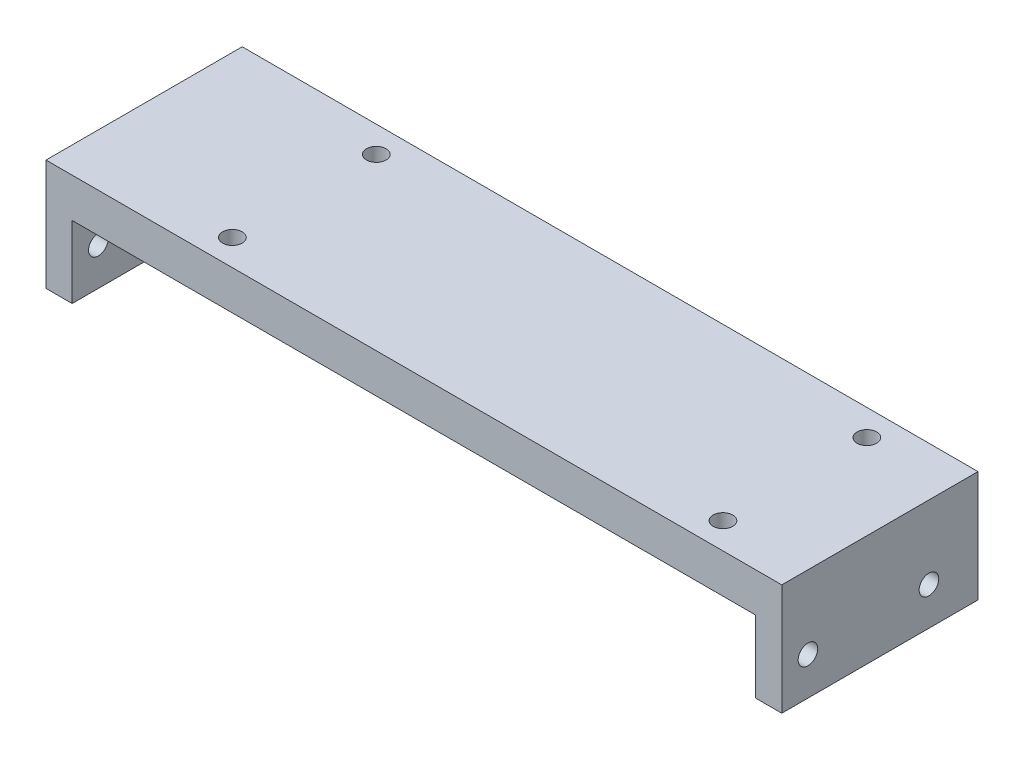
ISO-10303-21;
HEADER;
FILE_DESCRIPTION(('STEP AP214'),'2;1');
FILE_NAME('part.step','',(''),(''),'','','');
FILE_SCHEMA(('AUTOMOTIVE_DESIGN { 1 0 10303 214 1 1 1 1 }'));
ENDSEC;
DATA;
#1=APPLICATION_CONTEXT('core data for automotive mechanical design processes');
#2=APPLICATION_PROTOCOL_DEFINITION('international standard','automotive_design',2000,#1);
#3=PRODUCT_CONTEXT('',#1,'mechanical');
#4=PRODUCT('Part','Part','',(#3));
#5=PRODUCT_RELATED_PRODUCT_CATEGORY('part','',(#4));
#6=PRODUCT_DEFINITION_FORMATION('','',#4);
#7=PRODUCT_DEFINITION_CONTEXT('part definition',#1,'design');
#8=PRODUCT_DEFINITION('design','',#6,#7);
#9=PRODUCT_DEFINITION_SHAPE('','',#8);
#10=(LENGTH_UNIT() NAMED_UNIT(*) SI_UNIT(.MILLI.,.METRE.));
#11=(NAMED_UNIT(*) PLANE_ANGLE_UNIT() SI_UNIT($,.RADIAN.));
#12=(NAMED_UNIT(*) SI_UNIT($,.STERADIAN.) SOLID_ANGLE_UNIT());
#13=UNCERTAINTY_MEASURE_WITH_UNIT(LENGTH_MEASURE(1.E-05),#10,'distance_accuracy_value','');
#14=(GEOMETRIC_REPRESENTATION_CONTEXT(3) GLOBAL_UNCERTAINTY_ASSIGNED_CONTEXT((#13)) GLOBAL_UNIT_ASSIGNED_CONTEXT((#10,
#11,#12)) REPRESENTATION_CONTEXT('',''));
#15=CARTESIAN_POINT('',(0.,0.,0.));
#16=DIRECTION('',(0.,0.,1.));
#17=DIRECTION('',(1.,0.,0.));
#18=AXIS2_PLACEMENT_3D('',#15,#16,#17);
#19=CARTESIAN_POINT('',(0.,6.,0.));
#20=DIRECTION('',(0.,-1.,0.));
#21=DIRECTION('',(0.,0.,-1.));
#22=AXIS2_PLACEMENT_3D('',#19,#20,#21);
#23=PLANE('',#22);
#24=DIRECTION('',(-1.,0.,0.));
#25=VECTOR('',#24,1.);
#26=CARTESIAN_POINT('',(-52.25,6.,-15.));
#27=LINE('',#26,#25);
#28=CARTESIAN_POINT('',(56.25,6.,-15.));
#29=VERTEX_POINT('',#28);
#30=CARTESIAN_POINT('',(-56.25,6.,-15.));
#31=VERTEX_POINT('',#30);
#32=EDGE_CURVE('E45',#29,#31,#27,.T.);
#33=ORIENTED_EDGE('',*,*,#32,.T.);
#34=DIRECTION('',(0.,0.,-1.));
#35=VECTOR('',#34,1.);
#36=CARTESIAN_POINT('',(-56.25,6.,15.));
#37=LINE('',#36,#35);
#38=CARTESIAN_POINT('',(-56.25,6.,15.));
#39=VERTEX_POINT('',#38);
#40=EDGE_CURVE('E160',#39,#31,#37,.T.);
#41=ORIENTED_EDGE('',*,*,#40,.F.);
#42=DIRECTION('',(1.,0.,0.));
#43=VECTOR('',#42,1.);
#44=CARTESIAN_POINT('',(-52.25,6.,15.));
#45=LINE('',#44,#43);
#46=CARTESIAN_POINT('',(56.25,6.,15.));
#47=VERTEX_POINT('',#46);
#48=EDGE_CURVE('E11',#39,#47,#45,.T.);
#49=ORIENTED_EDGE('',*,*,#48,.T.);
#50=DIRECTION('',(0.,0.,1.));
#51=VECTOR('',#50,1.);
#52=CARTESIAN_POINT('',(56.25,6.,-15.));
#53=LINE('',#52,#51);
#54=EDGE_CURVE('E113',#29,#47,#53,.T.);
#55=ORIENTED_EDGE('',*,*,#54,.F.);
#56=EDGE_LOOP('',(#33,#41,#49,#55));
#57=FACE_BOUND('',#56,.T.);
#58=CARTESIAN_POINT('',(-31.75,6.,-11.));
#59=DIRECTION('',(0.,1.,0.));
#60=DIRECTION('',(0.,0.,1.));
#61=AXIS2_PLACEMENT_3D('',#58,#59,#60);
#62=CIRCLE('',#61,1.5);
#63=CARTESIAN_POINT('',(-31.75,6.,-9.5));
#64=VERTEX_POINT('',#63);
#65=EDGE_CURVE('E195',#64,#64,#62,.T.);
#66=ORIENTED_EDGE('',*,*,#65,.F.);
#67=EDGE_LOOP('',(#66));
#68=FACE_BOUND('',#67,.T.);
#69=CARTESIAN_POINT('',(43.25,6.,-11.));
#70=DIRECTION('',(0.,1.,0.));
#71=DIRECTION('',(0.,0.,1.));
#72=AXIS2_PLACEMENT_3D('',#69,#70,#71);
#73=CIRCLE('',#72,1.5);
#74=CARTESIAN_POINT('',(43.25,6.,-9.49999999999999));
#75=VERTEX_POINT('',#74);
#76=EDGE_CURVE('E189',#75,#75,#73,.T.);
#77=ORIENTED_EDGE('',*,*,#76,.F.);
#78=EDGE_LOOP('',(#77));
#79=FACE_BOUND('',#78,.T.);
#80=CARTESIAN_POINT('',(43.25,6.,11.));
#81=DIRECTION('',(0.,1.,0.));
#82=DIRECTION('',(0.,0.,-1.));
#83=AXIS2_PLACEMENT_3D('',#80,#81,#82);
#84=CIRCLE('',#83,1.5);
#85=CARTESIAN_POINT('',(43.25,6.,9.49999999999999));
#86=VERTEX_POINT('',#85);
#87=EDGE_CURVE('E183',#86,#86,#84,.T.);
#88=ORIENTED_EDGE('',*,*,#87,.F.);
#89=EDGE_LOOP('',(#88));
#90=FACE_BOUND('',#89,.T.);
#91=CARTESIAN_POINT('',(-31.75,6.,11.));
#92=DIRECTION('',(0.,1.,0.));
#93=DIRECTION('',(0.,0.,-1.));
#94=AXIS2_PLACEMENT_3D('',#91,#92,#93);
#95=CIRCLE('',#94,1.5);
#96=CARTESIAN_POINT('',(-31.75,6.,9.5));
#97=VERTEX_POINT('',#96);
#98=EDGE_CURVE('E177',#97,#97,#95,.T.);
#99=ORIENTED_EDGE('',*,*,#98,.F.);
#100=EDGE_LOOP('',(#99));
#101=FACE_BOUND('',#100,.T.);
#102=ADVANCED_FACE('F36',(#57,#68,#79,#90,#101),#23,.F.);
#103=CARTESIAN_POINT('',(0.,0.,0.));
#104=DIRECTION('',(0.,-1.,0.));
#105=DIRECTION('',(0.,0.,-1.));
#106=AXIS2_PLACEMENT_3D('',#103,#104,#105);
#107=PLANE('',#106);
#108=CARTESIAN_POINT('',(43.25,0.,11.));
#109=DIRECTION('',(0.,1.,0.));
#110=DIRECTION('',(0.,0.,-1.));
#111=AXIS2_PLACEMENT_3D('',#108,#109,#110);
#112=CIRCLE('',#111,1.5);
#113=CARTESIAN_POINT('',(43.25,0.,9.49999999999999));
#114=VERTEX_POINT('',#113);
#115=EDGE_CURVE('E180',#114,#114,#112,.T.);
#116=ORIENTED_EDGE('',*,*,#115,.T.);
#117=EDGE_LOOP('',(#116));
#118=FACE_BOUND('',#117,.T.);
#119=CARTESIAN_POINT('',(-31.75,0.,-11.));
#120=DIRECTION('',(0.,1.,0.));
#121=DIRECTION('',(0.,0.,1.));
#122=AXIS2_PLACEMENT_3D('',#119,#120,#121);
#123=CIRCLE('',#122,1.5);
#124=CARTESIAN_POINT('',(-31.75,0.,-9.5));
#125=VERTEX_POINT('',#124);
#126=EDGE_CURVE('E192',#125,#125,#123,.T.);
#127=ORIENTED_EDGE('',*,*,#126,.T.);
#128=EDGE_LOOP('',(#127));
#129=FACE_BOUND('',#128,.T.);
#130=DIRECTION('',(-1.,0.,0.));
#131=VECTOR('',#130,1.);
#132=CARTESIAN_POINT('',(-52.25,0.,-15.));
#133=LINE('',#132,#131);
#134=CARTESIAN_POINT('',(52.25,0.,-15.));
#135=VERTEX_POINT('',#134);
#136=CARTESIAN_POINT('',(-52.25,0.,-15.));
#137=VERTEX_POINT('',#136);
#138=EDGE_CURVE('E198',#135,#137,#133,.T.);
#139=ORIENTED_EDGE('',*,*,#138,.F.);
#140=DIRECTION('',(0.,0.,-1.));
#141=VECTOR('',#140,1.);
#142=CARTESIAN_POINT('',(52.25,0.,-15.));
#143=LINE('',#142,#141);
#144=CARTESIAN_POINT('',(52.25,0.,15.));
#145=VERTEX_POINT('',#144);
#146=EDGE_CURVE('E40',#145,#135,#143,.T.);
#147=ORIENTED_EDGE('',*,*,#146,.F.);
#148=DIRECTION('',(1.,0.,0.));
#149=VECTOR('',#148,1.);
#150=CARTESIAN_POINT('',(-52.25,0.,15.));
#151=LINE('',#150,#149);
#152=CARTESIAN_POINT('',(-52.25,0.,15.));
#153=VERTEX_POINT('',#152);
#154=EDGE_CURVE('E53',#153,#145,#151,.T.);
#155=ORIENTED_EDGE('',*,*,#154,.F.);
#156=DIRECTION('',(0.,0.,1.));
#157=VECTOR('',#156,1.);
#158=CARTESIAN_POINT('',(-52.25,0.,-15.));
#159=LINE('',#158,#157);
#160=EDGE_CURVE('E60',#137,#153,#159,.T.);
#161=ORIENTED_EDGE('',*,*,#160,.F.);
#162=EDGE_LOOP('',(#139,#147,#155,#161));
#163=FACE_BOUND('',#162,.T.);
#164=CARTESIAN_POINT('',(43.25,0.,-11.));
#165=DIRECTION('',(0.,1.,0.));
#166=DIRECTION('',(0.,0.,1.));
#167=AXIS2_PLACEMENT_3D('',#164,#165,#166);
#168=CIRCLE('',#167,1.5);
#169=CARTESIAN_POINT('',(43.25,0.,-9.49999999999999));
#170=VERTEX_POINT('',#169);
#171=EDGE_CURVE('E186',#170,#170,#168,.T.);
#172=ORIENTED_EDGE('',*,*,#171,.T.);
#173=EDGE_LOOP('',(#172));
#174=FACE_BOUND('',#173,.T.);
#175=CARTESIAN_POINT('',(-31.75,0.,11.));
#176=DIRECTION('',(0.,1.,0.));
#177=DIRECTION('',(0.,0.,-1.));
#178=AXIS2_PLACEMENT_3D('',#175,#176,#177);
#179=CIRCLE('',#178,1.5);
#180=CARTESIAN_POINT('',(-31.75,0.,9.5));
#181=VERTEX_POINT('',#180);
#182=EDGE_CURVE('E176',#181,#181,#179,.T.);
#183=ORIENTED_EDGE('',*,*,#182,.T.);
#184=EDGE_LOOP('',(#183));
#185=FACE_BOUND('',#184,.T.);
#186=ADVANCED_FACE('F246',(#118,#129,#163,#174,#185),#107,.T.);
#187=CARTESIAN_POINT('',(-52.25,6.,-15.));
#188=DIRECTION('',(0.,0.,1.));
#189=DIRECTION('',(1.,0.,0.));
#190=AXIS2_PLACEMENT_3D('',#187,#188,#189);
#191=PLANE('',#190);
#192=ORIENTED_EDGE('',*,*,#138,.T.);
#193=DIRECTION('',(0.,-1.,0.));
#194=VECTOR('',#193,1.);
#195=CARTESIAN_POINT('',(-52.25,6.,-15.));
#196=LINE('',#195,#194);
#197=CARTESIAN_POINT('',(-52.25,-11.,-15.));
#198=VERTEX_POINT('',#197);
#199=EDGE_CURVE('E168',#137,#198,#196,.T.);
#200=ORIENTED_EDGE('',*,*,#199,.T.);
#201=DIRECTION('',(1.,0.,0.));
#202=VECTOR('',#201,1.);
#203=CARTESIAN_POINT('',(-56.25,-11.,-15.));
#204=LINE('',#203,#202);
#205=CARTESIAN_POINT('',(-56.25,-11.,-15.));
#206=VERTEX_POINT('',#205);
#207=EDGE_CURVE('E173',#206,#198,#204,.T.);
#208=ORIENTED_EDGE('',*,*,#207,.F.);
#209=DIRECTION('',(0.,-1.,0.));
#210=VECTOR('',#209,1.);
#211=CARTESIAN_POINT('',(-56.25,6.,-15.));
#212=LINE('',#211,#210);
#213=EDGE_CURVE('E107',#31,#206,#212,.T.);
#214=ORIENTED_EDGE('',*,*,#213,.F.);
#215=ORIENTED_EDGE('',*,*,#32,.F.);
#216=DIRECTION('',(0.,1.,0.));
#217=VECTOR('',#216,1.);
#218=CARTESIAN_POINT('',(56.25,6.,-15.));
#219=LINE('',#218,#217);
#220=CARTESIAN_POINT('',(56.25,-11.,-15.));
#221=VERTEX_POINT('',#220);
#222=EDGE_CURVE('E105',#221,#29,#219,.T.);
#223=ORIENTED_EDGE('',*,*,#222,.F.);
#224=DIRECTION('',(-1.,0.,0.));
#225=VECTOR('',#224,1.);
#226=CARTESIAN_POINT('',(56.25,-11.,-15.));
#227=LINE('',#226,#225);
#228=CARTESIAN_POINT('',(52.25,-11.,-15.));
#229=VERTEX_POINT('',#228);
#230=EDGE_CURVE('E134',#221,#229,#227,.T.);
#231=ORIENTED_EDGE('',*,*,#230,.T.);
#232=DIRECTION('',(0.,1.,0.));
#233=VECTOR('',#232,1.);
#234=CARTESIAN_POINT('',(52.25,6.,-15.));
#235=LINE('',#234,#233);
#236=EDGE_CURVE('E135',#229,#135,#235,.T.);
#237=ORIENTED_EDGE('',*,*,#236,.T.);
#238=EDGE_LOOP('',(#192,#200,#208,#214,#215,#223,#231,#237));
#239=FACE_BOUND('',#238,.T.);
#240=ADVANCED_FACE('F38',(#239),#191,.F.);
#241=CARTESIAN_POINT('',(-52.25,6.,15.));
#242=DIRECTION('',(0.,0.,-1.));
#243=DIRECTION('',(-1.,0.,0.));
#244=AXIS2_PLACEMENT_3D('',#241,#242,#243);
#245=PLANE('',#244);
#246=ORIENTED_EDGE('',*,*,#154,.T.);
#247=DIRECTION('',(0.,-1.,0.));
#248=VECTOR('',#247,1.);
#249=CARTESIAN_POINT('',(52.25,6.,15.));
#250=LINE('',#249,#248);
#251=CARTESIAN_POINT('',(52.25,-11.,15.));
#252=VERTEX_POINT('',#251);
#253=EDGE_CURVE('E126',#145,#252,#250,.T.);
#254=ORIENTED_EDGE('',*,*,#253,.T.);
#255=DIRECTION('',(-1.,0.,0.));
#256=VECTOR('',#255,1.);
#257=CARTESIAN_POINT('',(56.25,-11.,15.));
#258=LINE('',#257,#256);
#259=CARTESIAN_POINT('',(56.25,-11.,15.));
#260=VERTEX_POINT('',#259);
#261=EDGE_CURVE('E141',#260,#252,#258,.T.);
#262=ORIENTED_EDGE('',*,*,#261,.F.);
#263=DIRECTION('',(0.,-1.,0.));
#264=VECTOR('',#263,1.);
#265=CARTESIAN_POINT('',(56.25,6.,15.));
#266=LINE('',#265,#264);
#267=EDGE_CURVE('E117',#47,#260,#266,.T.);
#268=ORIENTED_EDGE('',*,*,#267,.F.);
#269=ORIENTED_EDGE('',*,*,#48,.F.);
#270=DIRECTION('',(0.,1.,0.));
#271=VECTOR('',#270,1.);
#272=CARTESIAN_POINT('',(-56.25,6.,15.));
#273=LINE('',#272,#271);
#274=CARTESIAN_POINT('',(-56.25,-11.,15.));
#275=VERTEX_POINT('',#274);
#276=EDGE_CURVE('E157',#275,#39,#273,.T.);
#277=ORIENTED_EDGE('',*,*,#276,.F.);
#278=DIRECTION('',(1.,0.,0.));
#279=VECTOR('',#278,1.);
#280=CARTESIAN_POINT('',(-56.25,-11.,15.));
#281=LINE('',#280,#279);
#282=CARTESIAN_POINT('',(-52.25,-11.,15.));
#283=VERTEX_POINT('',#282);
#284=EDGE_CURVE('E166',#275,#283,#281,.T.);
#285=ORIENTED_EDGE('',*,*,#284,.T.);
#286=DIRECTION('',(0.,1.,0.));
#287=VECTOR('',#286,1.);
#288=CARTESIAN_POINT('',(-52.25,6.,15.));
#289=LINE('',#288,#287);
#290=EDGE_CURVE('E154',#283,#153,#289,.T.);
#291=ORIENTED_EDGE('',*,*,#290,.T.);
#292=EDGE_LOOP('',(#246,#254,#262,#268,#269,#277,#285,#291));
#293=FACE_BOUND('',#292,.T.);
#294=ADVANCED_FACE('F213',(#293),#245,.F.);
#295=CARTESIAN_POINT('',(-31.75,6.,-11.));
#296=DIRECTION('',(0.,-1.,0.));
#297=DIRECTION('',(0.,0.,-1.));
#298=AXIS2_PLACEMENT_3D('',#295,#296,#297);
#299=CYLINDRICAL_SURFACE('',#298,1.5);
#300=ORIENTED_EDGE('',*,*,#65,.T.);
#301=EDGE_LOOP('',(#300));
#302=FACE_BOUND('',#301,.T.);
#303=ORIENTED_EDGE('',*,*,#126,.F.);
#304=EDGE_LOOP('',(#303));
#305=FACE_BOUND('',#304,.T.);
#306=ADVANCED_FACE('F254',(#302,#305),#299,.F.);
#307=CARTESIAN_POINT('',(43.25,6.,-11.));
#308=DIRECTION('',(0.,-1.,0.));
#309=DIRECTION('',(0.,0.,-1.));
#310=AXIS2_PLACEMENT_3D('',#307,#308,#309);
#311=CYLINDRICAL_SURFACE('',#310,1.5);
#312=ORIENTED_EDGE('',*,*,#76,.T.);
#313=EDGE_LOOP('',(#312));
#314=FACE_BOUND('',#313,.T.);
#315=ORIENTED_EDGE('',*,*,#171,.F.);
#316=EDGE_LOOP('',(#315));
#317=FACE_BOUND('',#316,.T.);
#318=ADVANCED_FACE('F261',(#314,#317),#311,.F.);
#319=CARTESIAN_POINT('',(43.25,6.,11.));
#320=DIRECTION('',(0.,-1.,0.));
#321=DIRECTION('',(0.,0.,-1.));
#322=AXIS2_PLACEMENT_3D('',#319,#320,#321);
#323=CYLINDRICAL_SURFACE('',#322,1.5);
#324=ORIENTED_EDGE('',*,*,#87,.T.);
#325=EDGE_LOOP('',(#324));
#326=FACE_BOUND('',#325,.T.);
#327=ORIENTED_EDGE('',*,*,#115,.F.);
#328=EDGE_LOOP('',(#327));
#329=FACE_BOUND('',#328,.T.);
#330=ADVANCED_FACE('F319',(#326,#329),#323,.F.);
#331=CARTESIAN_POINT('',(-31.75,6.,11.));
#332=DIRECTION('',(0.,-1.,0.));
#333=DIRECTION('',(0.,0.,-1.));
#334=AXIS2_PLACEMENT_3D('',#331,#332,#333);
#335=CYLINDRICAL_SURFACE('',#334,1.5);
#336=ORIENTED_EDGE('',*,*,#98,.T.);
#337=EDGE_LOOP('',(#336));
#338=FACE_BOUND('',#337,.T.);
#339=ORIENTED_EDGE('',*,*,#182,.F.);
#340=EDGE_LOOP('',(#339));
#341=FACE_BOUND('',#340,.T.);
#342=ADVANCED_FACE('F309',(#338,#341),#335,.F.);
#343=CARTESIAN_POINT('',(-56.25,0.,0.));
#344=DIRECTION('',(1.,0.,0.));
#345=DIRECTION('',(0.,0.,-1.));
#346=AXIS2_PLACEMENT_3D('',#343,#344,#345);
#347=PLANE('',#346);
#348=ORIENTED_EDGE('',*,*,#276,.T.);
#349=ORIENTED_EDGE('',*,*,#40,.T.);
#350=ORIENTED_EDGE('',*,*,#213,.T.);
#351=DIRECTION('',(0.,0.,1.));
#352=VECTOR('',#351,1.);
#353=CARTESIAN_POINT('',(-56.25,-11.,15.));
#354=LINE('',#353,#352);
#355=EDGE_CURVE('E164',#206,#275,#354,.T.);
#356=ORIENTED_EDGE('',*,*,#355,.T.);
#357=EDGE_LOOP('',(#348,#349,#350,#356));
#358=FACE_BOUND('',#357,.T.);
#359=CARTESIAN_POINT('',(-56.25,-5.2,11.));
#360=DIRECTION('',(-1.,0.,0.));
#361=DIRECTION('',(0.,0.,1.));
#362=AXIS2_PLACEMENT_3D('',#359,#360,#361);
#363=CIRCLE('',#362,1.5);
#364=CARTESIAN_POINT('',(-56.25,-5.2,12.5));
#365=VERTEX_POINT('',#364);
#366=EDGE_CURVE('E151',#365,#365,#363,.T.);
#367=ORIENTED_EDGE('',*,*,#366,.F.);
#368=EDGE_LOOP('',(#367));
#369=FACE_BOUND('',#368,.T.);
#370=CARTESIAN_POINT('',(-56.25,-5.2,-11.));
#371=DIRECTION('',(-1.,0.,0.));
#372=DIRECTION('',(0.,0.,-1.));
#373=AXIS2_PLACEMENT_3D('',#370,#371,#372);
#374=CIRCLE('',#373,1.5);
#375=CARTESIAN_POINT('',(-56.25,-5.2,-12.5));
#376=VERTEX_POINT('',#375);
#377=EDGE_CURVE('E145',#376,#376,#374,.T.);
#378=ORIENTED_EDGE('',*,*,#377,.F.);
#379=EDGE_LOOP('',(#378));
#380=FACE_BOUND('',#379,.T.);
#381=ADVANCED_FACE('F216',(#358,#369,#380),#347,.F.);
#382=CARTESIAN_POINT('',(-52.25,0.,0.));
#383=DIRECTION('',(1.,0.,0.));
#384=DIRECTION('',(0.,0.,-1.));
#385=AXIS2_PLACEMENT_3D('',#382,#383,#384);
#386=PLANE('',#385);
#387=CARTESIAN_POINT('',(-52.25,-5.2,11.));
#388=DIRECTION('',(-1.,0.,0.));
#389=DIRECTION('',(0.,0.,1.));
#390=AXIS2_PLACEMENT_3D('',#387,#388,#389);
#391=CIRCLE('',#390,1.5);
#392=CARTESIAN_POINT('',(-52.25,-5.2,12.5));
#393=VERTEX_POINT('',#392);
#394=EDGE_CURVE('E148',#393,#393,#391,.T.);
#395=ORIENTED_EDGE('',*,*,#394,.T.);
#396=EDGE_LOOP('',(#395));
#397=FACE_BOUND('',#396,.T.);
#398=ORIENTED_EDGE('',*,*,#199,.F.);
#399=ORIENTED_EDGE('',*,*,#160,.T.);
#400=ORIENTED_EDGE('',*,*,#290,.F.);
#401=DIRECTION('',(0.,0.,1.));
#402=VECTOR('',#401,1.);
#403=CARTESIAN_POINT('',(-52.25,-11.,15.));
#404=LINE('',#403,#402);
#405=EDGE_CURVE('E161',#198,#283,#404,.T.);
#406=ORIENTED_EDGE('',*,*,#405,.F.);
#407=EDGE_LOOP('',(#398,#399,#400,#406));
#408=FACE_BOUND('',#407,.T.);
#409=CARTESIAN_POINT('',(-52.25,-5.2,-11.));
#410=DIRECTION('',(-1.,0.,0.));
#411=DIRECTION('',(0.,0.,-1.));
#412=AXIS2_PLACEMENT_3D('',#409,#410,#411);
#413=CIRCLE('',#412,1.5);
#414=CARTESIAN_POINT('',(-52.25,-5.2,-12.5));
#415=VERTEX_POINT('',#414);
#416=EDGE_CURVE('E144',#415,#415,#413,.T.);
#417=ORIENTED_EDGE('',*,*,#416,.T.);
#418=EDGE_LOOP('',(#417));
#419=FACE_BOUND('',#418,.T.);
#420=ADVANCED_FACE('F225',(#397,#408,#419),#386,.T.);
#421=CARTESIAN_POINT('',(-56.25,-11.,15.));
#422=DIRECTION('',(0.,1.,0.));
#423=DIRECTION('',(0.,0.,1.));
#424=AXIS2_PLACEMENT_3D('',#421,#422,#423);
#425=PLANE('',#424);
#426=ORIENTED_EDGE('',*,*,#405,.T.);
#427=ORIENTED_EDGE('',*,*,#284,.F.);
#428=ORIENTED_EDGE('',*,*,#355,.F.);
#429=ORIENTED_EDGE('',*,*,#207,.T.);
#430=EDGE_LOOP('',(#426,#427,#428,#429));
#431=FACE_BOUND('',#430,.T.);
#432=ADVANCED_FACE('F221',(#431),#425,.F.);
#433=CARTESIAN_POINT('',(-56.25,-5.2,11.));
#434=DIRECTION('',(1.,0.,0.));
#435=DIRECTION('',(0.,0.,-1.));
#436=AXIS2_PLACEMENT_3D('',#433,#434,#435);
#437=CYLINDRICAL_SURFACE('',#436,1.5);
#438=ORIENTED_EDGE('',*,*,#366,.T.);
#439=EDGE_LOOP('',(#438));
#440=FACE_BOUND('',#439,.T.);
#441=ORIENTED_EDGE('',*,*,#394,.F.);
#442=EDGE_LOOP('',(#441));
#443=FACE_BOUND('',#442,.T.);
#444=ADVANCED_FACE('F234',(#440,#443),#437,.F.);
#445=CARTESIAN_POINT('',(-56.25,-5.2,-11.));
#446=DIRECTION('',(1.,0.,0.));
#447=DIRECTION('',(0.,0.,-1.));
#448=AXIS2_PLACEMENT_3D('',#445,#446,#447);
#449=CYLINDRICAL_SURFACE('',#448,1.5);
#450=ORIENTED_EDGE('',*,*,#377,.T.);
#451=EDGE_LOOP('',(#450));
#452=FACE_BOUND('',#451,.T.);
#453=ORIENTED_EDGE('',*,*,#416,.F.);
#454=EDGE_LOOP('',(#453));
#455=FACE_BOUND('',#454,.T.);
#456=ADVANCED_FACE('F232',(#452,#455),#449,.F.);
#457=CARTESIAN_POINT('',(56.25,0.,0.));
#458=DIRECTION('',(-1.,0.,0.));
#459=DIRECTION('',(0.,0.,1.));
#460=AXIS2_PLACEMENT_3D('',#457,#458,#459);
#461=PLANE('',#460);
#462=ORIENTED_EDGE('',*,*,#222,.T.);
#463=ORIENTED_EDGE('',*,*,#54,.T.);
#464=ORIENTED_EDGE('',*,*,#267,.T.);
#465=DIRECTION('',(0.,0.,-1.));
#466=VECTOR('',#465,1.);
#467=CARTESIAN_POINT('',(56.25,-11.,-15.));
#468=LINE('',#467,#466);
#469=EDGE_CURVE('E122',#260,#221,#468,.T.);
#470=ORIENTED_EDGE('',*,*,#469,.T.);
#471=EDGE_LOOP('',(#462,#463,#464,#470));
#472=FACE_BOUND('',#471,.T.);
#473=CARTESIAN_POINT('',(56.25,-5.2,11.));
#474=DIRECTION('',(1.,0.,0.));
#475=DIRECTION('',(0.,0.,-1.));
#476=AXIS2_PLACEMENT_3D('',#473,#474,#475);
#477=CIRCLE('',#476,1.5);
#478=CARTESIAN_POINT('',(56.25,-5.2,9.5));
#479=VERTEX_POINT('',#478);
#480=EDGE_CURVE('E138',#479,#479,#477,.T.);
#481=ORIENTED_EDGE('',*,*,#480,.F.);
#482=EDGE_LOOP('',(#481));
#483=FACE_BOUND('',#482,.T.);
#484=CARTESIAN_POINT('',(56.25,-5.2,-7.5));
#485=DIRECTION('',(1.,0.,0.));
#486=DIRECTION('',(0.,0.,-1.));
#487=AXIS2_PLACEMENT_3D('',#484,#485,#486);
#488=CIRCLE('',#487,1.5);
#489=CARTESIAN_POINT('',(56.25,-5.2,-9.));
#490=VERTEX_POINT('',#489);
#491=EDGE_CURVE('E412',#490,#490,#488,.T.);
#492=ORIENTED_EDGE('',*,*,#491,.F.);
#493=EDGE_LOOP('',(#492));
#494=FACE_BOUND('',#493,.T.);
#495=ADVANCED_FACE('F119',(#472,#483,#494),#461,.F.);
#496=CARTESIAN_POINT('',(52.25,0.,0.));
#497=DIRECTION('',(-1.,0.,0.));
#498=DIRECTION('',(0.,0.,1.));
#499=AXIS2_PLACEMENT_3D('',#496,#497,#498);
#500=PLANE('',#499);
#501=CARTESIAN_POINT('',(52.25,-5.2,11.));
#502=DIRECTION('',(1.,0.,0.));
#503=DIRECTION('',(0.,0.,-1.));
#504=AXIS2_PLACEMENT_3D('',#501,#502,#503);
#505=CIRCLE('',#504,1.5);
#506=CARTESIAN_POINT('',(52.25,-5.2,9.5));
#507=VERTEX_POINT('',#506);
#508=EDGE_CURVE('E129',#507,#507,#505,.T.);
#509=ORIENTED_EDGE('',*,*,#508,.T.);
#510=EDGE_LOOP('',(#509));
#511=FACE_BOUND('',#510,.T.);
#512=ORIENTED_EDGE('',*,*,#253,.F.);
#513=ORIENTED_EDGE('',*,*,#146,.T.);
#514=ORIENTED_EDGE('',*,*,#236,.F.);
#515=DIRECTION('',(0.,0.,-1.));
#516=VECTOR('',#515,1.);
#517=CARTESIAN_POINT('',(52.25,-11.,-15.));
#518=LINE('',#517,#516);
#519=EDGE_CURVE('E124',#252,#229,#518,.T.);
#520=ORIENTED_EDGE('',*,*,#519,.F.);
#521=EDGE_LOOP('',(#512,#513,#514,#520));
#522=FACE_BOUND('',#521,.T.);
#523=CARTESIAN_POINT('',(52.25,-5.2,-7.5));
#524=DIRECTION('',(1.,0.,0.));
#525=DIRECTION('',(0.,0.,-1.));
#526=AXIS2_PLACEMENT_3D('',#523,#524,#525);
#527=CIRCLE('',#526,1.5);
#528=CARTESIAN_POINT('',(52.25,-5.2,-9.));
#529=VERTEX_POINT('',#528);
#530=EDGE_CURVE('E415',#529,#529,#527,.T.);
#531=ORIENTED_EDGE('',*,*,#530,.T.);
#532=EDGE_LOOP('',(#531));
#533=FACE_BOUND('',#532,.T.);
#534=ADVANCED_FACE('F206',(#511,#522,#533),#500,.T.);
#535=CARTESIAN_POINT('',(56.25,-11.,-15.));
#536=DIRECTION('',(0.,1.,0.));
#537=DIRECTION('',(0.,0.,1.));
#538=AXIS2_PLACEMENT_3D('',#535,#536,#537);
#539=PLANE('',#538);
#540=ORIENTED_EDGE('',*,*,#519,.T.);
#541=ORIENTED_EDGE('',*,*,#230,.F.);
#542=ORIENTED_EDGE('',*,*,#469,.F.);
#543=ORIENTED_EDGE('',*,*,#261,.T.);
#544=EDGE_LOOP('',(#540,#541,#542,#543));
#545=FACE_BOUND('',#544,.T.);
#546=ADVANCED_FACE('F211',(#545),#539,.F.);
#547=CARTESIAN_POINT('',(56.25,-5.2,11.));
#548=DIRECTION('',(-1.,0.,0.));
#549=DIRECTION('',(0.,0.,1.));
#550=AXIS2_PLACEMENT_3D('',#547,#548,#549);
#551=CYLINDRICAL_SURFACE('',#550,1.5);
#552=ORIENTED_EDGE('',*,*,#480,.T.);
#553=EDGE_LOOP('',(#552));
#554=FACE_BOUND('',#553,.T.);
#555=ORIENTED_EDGE('',*,*,#508,.F.);
#556=EDGE_LOOP('',(#555));
#557=FACE_BOUND('',#556,.T.);
#558=ADVANCED_FACE('F386',(#554,#557),#551,.F.);
#559=CARTESIAN_POINT('',(56.25,-5.2,-7.5));
#560=DIRECTION('',(-1.,0.,0.));
#561=DIRECTION('',(0.,0.,1.));
#562=AXIS2_PLACEMENT_3D('',#559,#560,#561);
#563=CYLINDRICAL_SURFACE('',#562,1.5);
#564=ORIENTED_EDGE('',*,*,#491,.T.);
#565=EDGE_LOOP('',(#564));
#566=FACE_BOUND('',#565,.T.);
#567=ORIENTED_EDGE('',*,*,#530,.F.);
#568=EDGE_LOOP('',(#567));
#569=FACE_BOUND('',#568,.T.);
#570=ADVANCED_FACE('F393',(#566,#569),#563,.F.);
#571=CLOSED_SHELL('',(#102,#186,#240,#294,#306,#318,#330,#342,#381,#420,#432,#444,#456,#495,
#534,#546,#558,#570));
#572=MANIFOLD_SOLID_BREP('B2',#571);
#573=ADVANCED_BREP_SHAPE_REPRESENTATION('',(#18,#572),#14);
#574=SHAPE_DEFINITION_REPRESENTATION(#9,#573);
ENDSEC;
END-ISO-10303-21;
